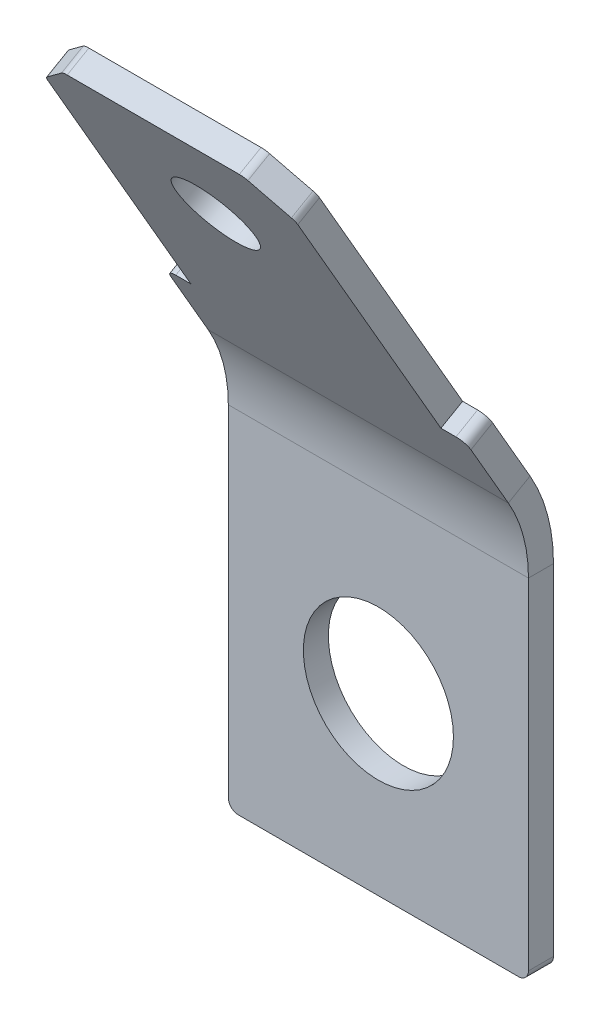
ISO-10303-21;
HEADER;
FILE_DESCRIPTION(('STEP AP214'),'2;1');
FILE_NAME('part.step','',(''),(''),'','','');
FILE_SCHEMA(('AUTOMOTIVE_DESIGN { 1 0 10303 214 1 1 1 1 }'));
ENDSEC;
DATA;
#1=APPLICATION_CONTEXT('core data for automotive mechanical design processes');
#2=APPLICATION_PROTOCOL_DEFINITION('international standard','automotive_design',2000,#1);
#3=PRODUCT_CONTEXT('',#1,'mechanical');
#4=PRODUCT('Part','Part','',(#3));
#5=PRODUCT_RELATED_PRODUCT_CATEGORY('part','',(#4));
#6=PRODUCT_DEFINITION_FORMATION('','',#4);
#7=PRODUCT_DEFINITION_CONTEXT('part definition',#1,'design');
#8=PRODUCT_DEFINITION('design','',#6,#7);
#9=PRODUCT_DEFINITION_SHAPE('','',#8);
#10=(LENGTH_UNIT() NAMED_UNIT(*) SI_UNIT(.MILLI.,.METRE.));
#11=(NAMED_UNIT(*) PLANE_ANGLE_UNIT() SI_UNIT($,.RADIAN.));
#12=(NAMED_UNIT(*) SI_UNIT($,.STERADIAN.) SOLID_ANGLE_UNIT());
#13=UNCERTAINTY_MEASURE_WITH_UNIT(LENGTH_MEASURE(1.E-05),#10,'distance_accuracy_value','');
#14=(GEOMETRIC_REPRESENTATION_CONTEXT(3) GLOBAL_UNCERTAINTY_ASSIGNED_CONTEXT((#13)) GLOBAL_UNIT_ASSIGNED_CONTEXT((#10,
#11,#12)) REPRESENTATION_CONTEXT('',''));
#15=CARTESIAN_POINT('',(0.,0.,0.));
#16=DIRECTION('',(0.,0.,1.));
#17=DIRECTION('',(1.,0.,0.));
#18=AXIS2_PLACEMENT_3D('',#15,#16,#17);
#19=CARTESIAN_POINT('',(0.,1.92884757729334,-1.94855715851498));
#20=DIRECTION('',(0.,-0.499999999999995,0.866025403784442));
#21=DIRECTION('',(0.,-0.866025403784442,-0.499999999999995));
#22=AXIS2_PLACEMENT_3D('',#19,#20,#21);
#23=PLANE('',#22);
#24=CARTESIAN_POINT('',(0.,10.1830127018922,2.81698729810775));
#25=DIRECTION('',(0.,-0.499999999999995,0.866025403784442));
#26=DIRECTION('',(0.,-0.866025403784442,-0.499999999999995));
#27=AXIS2_PLACEMENT_3D('',#24,#25,#26);
#28=CIRCLE('',#27,0.8);
#29=CARTESIAN_POINT('',(0.,9.49019237886468,2.41698729810775));
#30=VERTEX_POINT('',#29);
#31=EDGE_CURVE('E257',#30,#30,#28,.T.);
#32=ORIENTED_EDGE('',*,*,#31,.T.);
#33=EDGE_LOOP('',(#32));
#34=FACE_BOUND('',#33,.T.);
#35=DIRECTION('',(-1.,0.,0.));
#36=VECTOR('',#35,1.);
#37=CARTESIAN_POINT('',(2.49999999999999,6.71891108675446,0.816987298107766));
#38=LINE('',#37,#36);
#39=CARTESIAN_POINT('',(2.79999999999999,6.71891108675446,0.816987298107766));
#40=VERTEX_POINT('',#39);
#41=CARTESIAN_POINT('',(2.49999999999999,6.71891108675446,0.816987298107766));
#42=VERTEX_POINT('',#41);
#43=EDGE_CURVE('E230',#40,#42,#38,.T.);
#44=ORIENTED_EDGE('',*,*,#43,.F.);
#45=CARTESIAN_POINT('',(2.79999999999999,6.54570600599757,0.716987298107767));
#46=DIRECTION('',(0.,-0.499999999999995,0.866025403784442));
#47=DIRECTION('',(0.,-0.866025403784442,-0.499999999999995));
#48=AXIS2_PLACEMENT_3D('',#45,#46,#47);
#49=CIRCLE('',#48,0.2);
#50=CARTESIAN_POINT('',(2.99999999999999,6.54570600599757,0.716987298107767));
#51=VERTEX_POINT('',#50);
#52=EDGE_CURVE('E360',#40,#51,#49,.F.);
#53=ORIENTED_EDGE('',*,*,#52,.T.);
#54=DIRECTION('',(0.,-0.866025403784442,-0.499999999999995));
#55=VECTOR('',#54,1.);
#56=CARTESIAN_POINT('',(2.99999999999999,1.92884757729334,-1.94855715851498));
#57=LINE('',#56,#55);
#58=CARTESIAN_POINT('',(2.99999999999999,5.24999999999999,-0.0310889132455459));
#59=VERTEX_POINT('',#58);
#60=EDGE_CURVE('E269',#51,#59,#57,.T.);
#61=ORIENTED_EDGE('',*,*,#60,.T.);
#62=DIRECTION('',(-1.,0.,0.));
#63=VECTOR('',#62,1.);
#64=CARTESIAN_POINT('',(2.99999999999999,5.24999999999999,-0.0310889132455455));
#65=LINE('',#64,#63);
#66=CARTESIAN_POINT('',(-3.00000000000001,5.24999999999999,-0.0310889132455449));
#67=VERTEX_POINT('',#66);
#68=EDGE_CURVE('E286',#67,#59,#65,.F.);
#69=ORIENTED_EDGE('',*,*,#68,.F.);
#70=DIRECTION('',(0.,0.866025403784442,0.499999999999995));
#71=VECTOR('',#70,1.);
#72=CARTESIAN_POINT('',(-3.00000000000001,1.92884757729334,-1.94855715851498));
#73=LINE('',#72,#71);
#74=CARTESIAN_POINT('',(-3.00000000000001,6.54570600599757,0.716987298107767));
#75=VERTEX_POINT('',#74);
#76=EDGE_CURVE('E275',#67,#75,#73,.T.);
#77=ORIENTED_EDGE('',*,*,#76,.T.);
#78=CARTESIAN_POINT('',(-2.80000000000001,6.54570600599757,0.716987298107767));
#79=DIRECTION('',(0.,-0.499999999999995,0.866025403784442));
#80=DIRECTION('',(0.,-0.866025403784442,-0.499999999999995));
#81=AXIS2_PLACEMENT_3D('',#78,#79,#80);
#82=CIRCLE('',#81,0.2);
#83=CARTESIAN_POINT('',(-2.80000000000001,6.71891108675446,0.816987298107766));
#84=VERTEX_POINT('',#83);
#85=EDGE_CURVE('E358',#75,#84,#82,.F.);
#86=ORIENTED_EDGE('',*,*,#85,.T.);
#87=DIRECTION('',(-1.,0.,0.));
#88=VECTOR('',#87,1.);
#89=CARTESIAN_POINT('',(-2.50000000000001,6.71891108675446,0.816987298107766));
#90=LINE('',#89,#88);
#91=CARTESIAN_POINT('',(-2.50000000000001,6.71891108675446,0.816987298107767));
#92=VERTEX_POINT('',#91);
#93=EDGE_CURVE('E245',#92,#84,#90,.T.);
#94=ORIENTED_EDGE('',*,*,#93,.F.);
#95=DIRECTION('',(0.,-0.866025403784442,-0.499999999999995));
#96=VECTOR('',#95,1.);
#97=CARTESIAN_POINT('',(-2.50000000000001,11.7451905283833,3.71891108675442));
#98=LINE('',#97,#96);
#99=CARTESIAN_POINT('',(-2.50000000000001,11.6734466348619,3.67748973051712));
#100=VERTEX_POINT('',#99);
#101=EDGE_CURVE('E234',#100,#92,#98,.T.);
#102=ORIENTED_EDGE('',*,*,#101,.F.);
#103=CARTESIAN_POINT('',(-2.30000000000001,11.6734466348619,3.67748973051712));
#104=DIRECTION('',(0.,-0.499999999999995,0.866025403784442));
#105=DIRECTION('',(0.,-0.866025403784442,-0.499999999999995));
#106=AXIS2_PLACEMENT_3D('',#103,#104,#105);
#107=CIRCLE('',#106,0.2);
#108=CARTESIAN_POINT('',(-2.44142135623732,11.795921122001,3.74820040863577));
#109=VERTEX_POINT('',#108);
#110=EDGE_CURVE('E356',#100,#109,#107,.F.);
#111=ORIENTED_EDGE('',*,*,#110,.T.);
#112=DIRECTION('',(-0.707106781186552,-0.612372435695793,-0.353553390593268));
#113=VECTOR('',#112,1.);
#114=CARTESIAN_POINT('',(-1.80384757729338,12.3480762113533,4.06698729810773));
#115=LINE('',#114,#113);
#116=CARTESIAN_POINT('',(-1.86242622105607,12.2973456177356,4.03769797622639));
#117=VERTEX_POINT('',#116);
#118=EDGE_CURVE('E231',#117,#109,#115,.T.);
#119=ORIENTED_EDGE('',*,*,#118,.F.);
#120=CARTESIAN_POINT('',(-1.72100486481876,12.1748711305964,3.96698729810774));
#121=DIRECTION('',(0.,-0.499999999999995,0.866025403784442));
#122=DIRECTION('',(0.,-0.866025403784442,-0.499999999999995));
#123=AXIS2_PLACEMENT_3D('',#120,#121,#122);
#124=CIRCLE('',#123,0.2);
#125=CARTESIAN_POINT('',(-1.72100486481876,12.3480762113533,4.06698729810773));
#126=VERTEX_POINT('',#125);
#127=EDGE_CURVE('E354',#117,#126,#124,.F.);
#128=ORIENTED_EDGE('',*,*,#127,.T.);
#129=DIRECTION('',(1.,0.,0.));
#130=VECTOR('',#129,1.);
#131=CARTESIAN_POINT('',(0.,12.3480762113533,4.06698729810773));
#132=LINE('',#131,#130);
#133=CARTESIAN_POINT('',(1.72100486481874,12.3480762113533,4.06698729810773));
#134=VERTEX_POINT('',#133);
#135=EDGE_CURVE('E272',#126,#134,#132,.T.);
#136=ORIENTED_EDGE('',*,*,#135,.T.);
#137=CARTESIAN_POINT('',(1.72100486481874,12.1748711305964,3.96698729810774));
#138=DIRECTION('',(0.,-0.499999999999995,0.866025403784442));
#139=DIRECTION('',(0.,-0.866025403784442,-0.499999999999995));
#140=AXIS2_PLACEMENT_3D('',#137,#138,#139);
#141=CIRCLE('',#140,0.2);
#142=CARTESIAN_POINT('',(1.86242622105605,12.2973456177356,4.03769797622639));
#143=VERTEX_POINT('',#142);
#144=EDGE_CURVE('E352',#134,#143,#141,.F.);
#145=ORIENTED_EDGE('',*,*,#144,.T.);
#146=DIRECTION('',(-0.707106781186551,0.612372435695793,0.353553390593268));
#147=VECTOR('',#146,1.);
#148=CARTESIAN_POINT('',(1.80384757729335,12.3480762113533,4.06698729810773));
#149=LINE('',#148,#147);
#150=CARTESIAN_POINT('',(2.4414213562373,11.795921122001,3.74820040863577));
#151=VERTEX_POINT('',#150);
#152=EDGE_CURVE('E215',#151,#143,#149,.T.);
#153=ORIENTED_EDGE('',*,*,#152,.F.);
#154=CARTESIAN_POINT('',(2.29999999999999,11.6734466348619,3.67748973051711));
#155=DIRECTION('',(0.,-0.499999999999995,0.866025403784442));
#156=DIRECTION('',(0.,-0.866025403784442,-0.499999999999995));
#157=AXIS2_PLACEMENT_3D('',#154,#155,#156);
#158=CIRCLE('',#157,0.2);
#159=CARTESIAN_POINT('',(2.49999999999999,11.6734466348619,3.67748973051711));
#160=VERTEX_POINT('',#159);
#161=EDGE_CURVE('E350',#151,#160,#158,.F.);
#162=ORIENTED_EDGE('',*,*,#161,.T.);
#163=DIRECTION('',(0.,0.866025403784442,0.499999999999995));
#164=VECTOR('',#163,1.);
#165=CARTESIAN_POINT('',(2.49999999999999,11.7451905283833,3.71891108675442));
#166=LINE('',#165,#164);
#167=EDGE_CURVE('E483',#42,#160,#166,.T.);
#168=ORIENTED_EDGE('',*,*,#167,.F.);
#169=EDGE_LOOP('',(#44,#53,#61,#69,#77,#86,#94,#102,#111,#119,#128,#136,#145,#153,#162,#168));
#170=FACE_BOUND('',#169,.T.);
#171=ADVANCED_FACE('F57',(#34,#170),#23,.F.);
#172=CARTESIAN_POINT('',(0.,1.67884757729334,-1.51554445662276));
#173=DIRECTION('',(0.,-0.499999999999995,0.866025403784442));
#174=DIRECTION('',(0.,-0.866025403784442,-0.499999999999995));
#175=AXIS2_PLACEMENT_3D('',#172,#173,#174);
#176=PLANE('',#175);
#177=CARTESIAN_POINT('',(0.,9.93301270189223,3.24999999999997));
#178=DIRECTION('',(0.,-0.499999999999995,0.866025403784442));
#179=DIRECTION('',(0.,-0.866025403784442,-0.499999999999995));
#180=AXIS2_PLACEMENT_3D('',#177,#178,#179);
#181=CIRCLE('',#180,0.8);
#182=CARTESIAN_POINT('',(0.,9.24019237886468,2.84999999999997));
#183=VERTEX_POINT('',#182);
#184=EDGE_CURVE('E256',#183,#183,#181,.T.);
#185=ORIENTED_EDGE('',*,*,#184,.F.);
#186=EDGE_LOOP('',(#185));
#187=FACE_BOUND('',#186,.T.);
#188=DIRECTION('',(0.,0.866025403784442,0.499999999999995));
#189=VECTOR('',#188,1.);
#190=CARTESIAN_POINT('',(2.99999999999999,4.30384757729336,0.));
#191=LINE('',#190,#189);
#192=CARTESIAN_POINT('',(2.99999999999999,6.29570600599758,1.14999999999999));
#193=VERTEX_POINT('',#192);
#194=CARTESIAN_POINT('',(2.99999999999999,4.99999999999999,0.401923788646675));
#195=VERTEX_POINT('',#194);
#196=EDGE_CURVE('E278',#193,#195,#191,.F.);
#197=ORIENTED_EDGE('',*,*,#196,.F.);
#198=CARTESIAN_POINT('',(2.79999999999999,6.29570600599758,1.14999999999999));
#199=DIRECTION('',(0.,-0.499999999999995,0.866025403784442));
#200=DIRECTION('',(0.,-0.866025403784442,-0.499999999999995));
#201=AXIS2_PLACEMENT_3D('',#198,#199,#200);
#202=CIRCLE('',#201,0.2);
#203=CARTESIAN_POINT('',(2.79999999999999,6.46891108675446,1.24999999999999));
#204=VERTEX_POINT('',#203);
#205=EDGE_CURVE('E211',#193,#204,#202,.T.);
#206=ORIENTED_EDGE('',*,*,#205,.T.);
#207=DIRECTION('',(1.,0.,0.));
#208=VECTOR('',#207,1.);
#209=CARTESIAN_POINT('',(0.,6.46891108675446,1.24999999999999));
#210=LINE('',#209,#208);
#211=CARTESIAN_POINT('',(2.49999999999999,6.46891108675446,1.24999999999999));
#212=VERTEX_POINT('',#211);
#213=EDGE_CURVE('E206',#204,#212,#210,.F.);
#214=ORIENTED_EDGE('',*,*,#213,.T.);
#215=DIRECTION('',(0.,-0.866025403784442,-0.499999999999995));
#216=VECTOR('',#215,1.);
#217=CARTESIAN_POINT('',(2.49999999999999,1.67884757729334,-1.51554445662276));
#218=LINE('',#217,#216);
#219=CARTESIAN_POINT('',(2.49999999999999,11.4234466348619,4.11050243240934));
#220=VERTEX_POINT('',#219);
#221=EDGE_CURVE('E210',#212,#220,#218,.F.);
#222=ORIENTED_EDGE('',*,*,#221,.T.);
#223=CARTESIAN_POINT('',(2.29999999999999,11.4234466348619,4.11050243240933));
#224=DIRECTION('',(0.,-0.499999999999995,0.866025403784442));
#225=DIRECTION('',(0.,-0.866025403784442,-0.499999999999995));
#226=AXIS2_PLACEMENT_3D('',#223,#224,#225);
#227=CIRCLE('',#226,0.2);
#228=CARTESIAN_POINT('',(2.4414213562373,11.545921122001,4.18121311052799));
#229=VERTEX_POINT('',#228);
#230=EDGE_CURVE('E337',#220,#229,#227,.T.);
#231=ORIENTED_EDGE('',*,*,#230,.T.);
#232=DIRECTION('',(-0.707106781186551,0.612372435695793,0.353553390593268));
#233=VECTOR('',#232,1.);
#234=CARTESIAN_POINT('',(1.80384757729335,12.0980762113533,4.49999999999995));
#235=LINE('',#234,#233);
#236=CARTESIAN_POINT('',(1.86242622105605,12.0473456177356,4.47071067811861));
#237=VERTEX_POINT('',#236);
#238=EDGE_CURVE('E226',#229,#237,#235,.T.);
#239=ORIENTED_EDGE('',*,*,#238,.T.);
#240=CARTESIAN_POINT('',(1.72100486481874,11.9248711305964,4.39999999999996));
#241=DIRECTION('',(0.,-0.499999999999995,0.866025403784442));
#242=DIRECTION('',(0.,-0.866025403784442,-0.499999999999995));
#243=AXIS2_PLACEMENT_3D('',#240,#241,#242);
#244=CIRCLE('',#243,0.2);
#245=CARTESIAN_POINT('',(1.72100486481874,12.0980762113533,4.49999999999995));
#246=VERTEX_POINT('',#245);
#247=EDGE_CURVE('E339',#237,#246,#244,.T.);
#248=ORIENTED_EDGE('',*,*,#247,.T.);
#249=DIRECTION('',(-1.,0.,0.));
#250=VECTOR('',#249,1.);
#251=CARTESIAN_POINT('',(2.99999999999999,12.0980762113533,4.49999999999995));
#252=LINE('',#251,#250);
#253=CARTESIAN_POINT('',(-1.72100486481876,12.0980762113533,4.49999999999995));
#254=VERTEX_POINT('',#253);
#255=EDGE_CURVE('E280',#254,#246,#252,.F.);
#256=ORIENTED_EDGE('',*,*,#255,.F.);
#257=CARTESIAN_POINT('',(-1.72100486481876,11.9248711305964,4.39999999999996));
#258=DIRECTION('',(0.,-0.499999999999995,0.866025403784442));
#259=DIRECTION('',(0.,-0.866025403784442,-0.499999999999995));
#260=AXIS2_PLACEMENT_3D('',#257,#258,#259);
#261=CIRCLE('',#260,0.2);
#262=CARTESIAN_POINT('',(-1.86242622105607,12.0473456177356,4.47071067811861));
#263=VERTEX_POINT('',#262);
#264=EDGE_CURVE('E341',#254,#263,#261,.T.);
#265=ORIENTED_EDGE('',*,*,#264,.T.);
#266=DIRECTION('',(-0.707106781186552,-0.612372435695793,-0.353553390593268));
#267=VECTOR('',#266,1.);
#268=CARTESIAN_POINT('',(-1.80384757729338,12.0980762113533,4.49999999999995));
#269=LINE('',#268,#267);
#270=CARTESIAN_POINT('',(-2.44142135623732,11.545921122001,4.18121311052799));
#271=VERTEX_POINT('',#270);
#272=EDGE_CURVE('E241',#263,#271,#269,.T.);
#273=ORIENTED_EDGE('',*,*,#272,.T.);
#274=CARTESIAN_POINT('',(-2.30000000000001,11.4234466348619,4.11050243240934));
#275=DIRECTION('',(0.,-0.499999999999995,0.866025403784442));
#276=DIRECTION('',(0.,-0.866025403784442,-0.499999999999995));
#277=AXIS2_PLACEMENT_3D('',#274,#275,#276);
#278=CIRCLE('',#277,0.2);
#279=CARTESIAN_POINT('',(-2.50000000000001,11.4234466348619,4.11050243240934));
#280=VERTEX_POINT('',#279);
#281=EDGE_CURVE('E343',#271,#280,#278,.T.);
#282=ORIENTED_EDGE('',*,*,#281,.T.);
#283=DIRECTION('',(0.,-0.866025403784442,-0.499999999999995));
#284=VECTOR('',#283,1.);
#285=CARTESIAN_POINT('',(-2.50000000000001,1.67884757729334,-1.51554445662276));
#286=LINE('',#285,#284);
#287=CARTESIAN_POINT('',(-2.50000000000001,6.46891108675446,1.24999999999999));
#288=VERTEX_POINT('',#287);
#289=EDGE_CURVE('E244',#280,#288,#286,.T.);
#290=ORIENTED_EDGE('',*,*,#289,.T.);
#291=DIRECTION('',(1.,0.,0.));
#292=VECTOR('',#291,1.);
#293=CARTESIAN_POINT('',(0.,6.46891108675446,1.24999999999999));
#294=LINE('',#293,#292);
#295=CARTESIAN_POINT('',(-2.80000000000001,6.46891108675446,1.24999999999999));
#296=VERTEX_POINT('',#295);
#297=EDGE_CURVE('E246',#288,#296,#294,.F.);
#298=ORIENTED_EDGE('',*,*,#297,.T.);
#299=CARTESIAN_POINT('',(-2.80000000000001,6.29570600599758,1.14999999999999));
#300=DIRECTION('',(0.,-0.499999999999995,0.866025403784442));
#301=DIRECTION('',(0.,-0.866025403784442,-0.499999999999995));
#302=AXIS2_PLACEMENT_3D('',#299,#300,#301);
#303=CIRCLE('',#302,0.2);
#304=CARTESIAN_POINT('',(-3.00000000000001,6.29570600599758,1.14999999999999));
#305=VERTEX_POINT('',#304);
#306=EDGE_CURVE('E345',#296,#305,#303,.T.);
#307=ORIENTED_EDGE('',*,*,#306,.T.);
#308=DIRECTION('',(0.,-0.866025403784442,-0.499999999999995));
#309=VECTOR('',#308,1.);
#310=CARTESIAN_POINT('',(-3.00000000000001,12.0980762113533,4.49999999999995));
#311=LINE('',#310,#309);
#312=CARTESIAN_POINT('',(-3.00000000000001,4.99999999999999,0.401923788646675));
#313=VERTEX_POINT('',#312);
#314=EDGE_CURVE('E283',#313,#305,#311,.F.);
#315=ORIENTED_EDGE('',*,*,#314,.F.);
#316=DIRECTION('',(-1.,0.,0.));
#317=VECTOR('',#316,1.);
#318=CARTESIAN_POINT('',(2.99999999999999,4.99999999999999,0.401923788646675));
#319=LINE('',#318,#317);
#320=EDGE_CURVE('E292',#195,#313,#319,.T.);
#321=ORIENTED_EDGE('',*,*,#320,.F.);
#322=EDGE_LOOP('',(#197,#206,#214,#222,#231,#239,#248,#256,#265,#273,#282,#290,#298,#307,#315,#321));
#323=FACE_BOUND('',#322,.T.);
#324=ADVANCED_FACE('F209',(#187,#323),#176,.T.);
#325=CARTESIAN_POINT('',(2.99999999999999,12.3480762113533,4.06698729810773));
#326=DIRECTION('',(0.,-0.866025403784442,-0.499999999999995));
#327=DIRECTION('',(0.,0.499999999999995,-0.866025403784442));
#328=AXIS2_PLACEMENT_3D('',#325,#326,#327);
#329=PLANE('',#328);
#330=ORIENTED_EDGE('',*,*,#135,.F.);
#331=DIRECTION('',(0.,-0.499999999999995,0.866025403784442));
#332=VECTOR('',#331,1.);
#333=CARTESIAN_POINT('',(-1.72100486481876,12.0980762113533,4.49999999999995));
#334=LINE('',#333,#332);
#335=EDGE_CURVE('E376',#126,#254,#334,.T.);
#336=ORIENTED_EDGE('',*,*,#335,.T.);
#337=ORIENTED_EDGE('',*,*,#255,.T.);
#338=DIRECTION('',(0.,-0.499999999999995,0.866025403784442));
#339=VECTOR('',#338,1.);
#340=CARTESIAN_POINT('',(1.72100486481874,12.3480762113533,4.06698729810773));
#341=LINE('',#340,#339);
#342=EDGE_CURVE('E374',#246,#134,#341,.F.);
#343=ORIENTED_EDGE('',*,*,#342,.T.);
#344=EDGE_LOOP('',(#330,#336,#337,#343));
#345=FACE_BOUND('',#344,.T.);
#346=ADVANCED_FACE('F470',(#345),#329,.F.);
#347=CARTESIAN_POINT('',(2.99999999999999,4.55384757729336,-0.433012701892221));
#348=DIRECTION('',(-1.,0.,0.));
#349=DIRECTION('',(0.,0.,1.));
#350=AXIS2_PLACEMENT_3D('',#347,#348,#349);
#351=PLANE('',#350);
#352=ORIENTED_EDGE('',*,*,#60,.F.);
#353=DIRECTION('',(0.,-0.499999999999995,0.866025403784442));
#354=VECTOR('',#353,1.);
#355=CARTESIAN_POINT('',(2.99999999999999,6.29570600599758,1.14999999999999));
#356=LINE('',#355,#354);
#357=EDGE_CURVE('E332',#51,#193,#356,.T.);
#358=ORIENTED_EDGE('',*,*,#357,.T.);
#359=ORIENTED_EDGE('',*,*,#196,.T.);
#360=DIRECTION('',(0.,-0.499999999999995,0.866025403784442));
#361=VECTOR('',#360,1.);
#362=CARTESIAN_POINT('',(2.99999999999999,5.24999999999999,-0.0310889132455457));
#363=LINE('',#362,#361);
#364=EDGE_CURVE('E266',#195,#59,#363,.F.);
#365=ORIENTED_EDGE('',*,*,#364,.T.);
#366=EDGE_LOOP('',(#352,#358,#359,#365));
#367=FACE_BOUND('',#366,.T.);
#368=ADVANCED_FACE('F428',(#367),#351,.F.);
#369=CARTESIAN_POINT('',(-3.00000000000001,12.3480762113533,4.06698729810773));
#370=DIRECTION('',(1.,0.,0.));
#371=DIRECTION('',(0.,0.,-1.));
#372=AXIS2_PLACEMENT_3D('',#369,#370,#371);
#373=PLANE('',#372);
#374=ORIENTED_EDGE('',*,*,#314,.T.);
#375=DIRECTION('',(0.,-0.499999999999995,0.866025403784442));
#376=VECTOR('',#375,1.);
#377=CARTESIAN_POINT('',(-3.00000000000001,6.54570600599757,0.716987298107767));
#378=LINE('',#377,#376);
#379=EDGE_CURVE('E365',#305,#75,#378,.F.);
#380=ORIENTED_EDGE('',*,*,#379,.T.);
#381=ORIENTED_EDGE('',*,*,#76,.F.);
#382=DIRECTION('',(0.,-0.499999999999995,0.866025403784442));
#383=VECTOR('',#382,1.);
#384=CARTESIAN_POINT('',(-3.00000000000001,4.99999999999999,0.401923788646676));
#385=LINE('',#384,#383);
#386=EDGE_CURVE('E289',#313,#67,#385,.F.);
#387=ORIENTED_EDGE('',*,*,#386,.F.);
#388=EDGE_LOOP('',(#374,#380,#381,#387));
#389=FACE_BOUND('',#388,.T.);
#390=ADVANCED_FACE('F437',(#389),#373,.F.);
#391=CARTESIAN_POINT('',(2.99999999999999,-3.5,-0.5));
#392=DIRECTION('',(1.,0.,0.));
#393=DIRECTION('',(0.,0.,-1.));
#394=AXIS2_PLACEMENT_3D('',#391,#392,#393);
#395=PLANE('',#394);
#396=DIRECTION('',(0.,1.,0.));
#397=VECTOR('',#396,1.);
#398=CARTESIAN_POINT('',(2.99999999999999,-3.5,0.));
#399=LINE('',#398,#397);
#400=CARTESIAN_POINT('',(2.99999999999999,-3.3,0.));
#401=VERTEX_POINT('',#400);
#402=CARTESIAN_POINT('',(2.99999999999999,3.5,0.));
#403=VERTEX_POINT('',#402);
#404=EDGE_CURVE('E299',#401,#403,#399,.T.);
#405=ORIENTED_EDGE('',*,*,#404,.F.);
#406=DIRECTION('',(0.,0.,1.));
#407=VECTOR('',#406,1.);
#408=CARTESIAN_POINT('',(2.99999999999999,-3.3,-0.5));
#409=LINE('',#408,#407);
#410=CARTESIAN_POINT('',(2.99999999999999,-3.3,-0.5));
#411=VERTEX_POINT('',#410);
#412=EDGE_CURVE('E13',#401,#411,#409,.F.);
#413=ORIENTED_EDGE('',*,*,#412,.T.);
#414=DIRECTION('',(0.,1.,0.));
#415=VECTOR('',#414,1.);
#416=CARTESIAN_POINT('',(2.99999999999999,-3.5,-0.5));
#417=LINE('',#416,#415);
#418=CARTESIAN_POINT('',(2.99999999999999,3.5,-0.5));
#419=VERTEX_POINT('',#418);
#420=EDGE_CURVE('E308',#411,#419,#417,.T.);
#421=ORIENTED_EDGE('',*,*,#420,.T.);
#422=DIRECTION('',(0.,0.,1.));
#423=VECTOR('',#422,1.);
#424=CARTESIAN_POINT('',(2.99999999999999,3.5,-0.5));
#425=LINE('',#424,#423);
#426=EDGE_CURVE('E319',#419,#403,#425,.T.);
#427=ORIENTED_EDGE('',*,*,#426,.T.);
#428=EDGE_LOOP('',(#405,#413,#421,#427));
#429=FACE_BOUND('',#428,.T.);
#430=ADVANCED_FACE('F414',(#429),#395,.T.);
#431=CARTESIAN_POINT('',(-3.00000000000001,-3.5,-0.5));
#432=DIRECTION('',(0.,-1.,0.));
#433=DIRECTION('',(0.,0.,-1.));
#434=AXIS2_PLACEMENT_3D('',#431,#432,#433);
#435=PLANE('',#434);
#436=DIRECTION('',(1.,0.,0.));
#437=VECTOR('',#436,1.);
#438=CARTESIAN_POINT('',(-3.00000000000001,-3.5,0.));
#439=LINE('',#438,#437);
#440=CARTESIAN_POINT('',(-2.80000000000001,-3.5,0.));
#441=VERTEX_POINT('',#440);
#442=CARTESIAN_POINT('',(2.79999999999999,-3.5,0.));
#443=VERTEX_POINT('',#442);
#444=EDGE_CURVE('E311',#441,#443,#439,.T.);
#445=ORIENTED_EDGE('',*,*,#444,.F.);
#446=DIRECTION('',(0.,0.,1.));
#447=VECTOR('',#446,1.);
#448=CARTESIAN_POINT('',(-2.80000000000001,-3.5,-0.5));
#449=LINE('',#448,#447);
#450=CARTESIAN_POINT('',(-2.80000000000001,-3.5,-0.5));
#451=VERTEX_POINT('',#450);
#452=EDGE_CURVE('E395',#441,#451,#449,.F.);
#453=ORIENTED_EDGE('',*,*,#452,.T.);
#454=DIRECTION('',(1.,0.,0.));
#455=VECTOR('',#454,1.);
#456=CARTESIAN_POINT('',(-3.00000000000001,-3.5,-0.5));
#457=LINE('',#456,#455);
#458=CARTESIAN_POINT('',(2.79999999999999,-3.5,-0.5));
#459=VERTEX_POINT('',#458);
#460=EDGE_CURVE('E317',#451,#459,#457,.T.);
#461=ORIENTED_EDGE('',*,*,#460,.T.);
#462=DIRECTION('',(0.,0.,1.));
#463=VECTOR('',#462,1.);
#464=CARTESIAN_POINT('',(2.79999999999999,-3.5,-0.5));
#465=LINE('',#464,#463);
#466=EDGE_CURVE('E392',#459,#443,#465,.T.);
#467=ORIENTED_EDGE('',*,*,#466,.T.);
#468=EDGE_LOOP('',(#445,#453,#461,#467));
#469=FACE_BOUND('',#468,.T.);
#470=ADVANCED_FACE('F411',(#469),#435,.T.);
#471=CARTESIAN_POINT('',(-3.00000000000001,-3.5,-0.5));
#472=DIRECTION('',(-1.,0.,0.));
#473=DIRECTION('',(0.,0.,1.));
#474=AXIS2_PLACEMENT_3D('',#471,#472,#473);
#475=PLANE('',#474);
#476=DIRECTION('',(0.,-1.,0.));
#477=VECTOR('',#476,1.);
#478=CARTESIAN_POINT('',(-3.00000000000001,-3.5,-0.5));
#479=LINE('',#478,#477);
#480=CARTESIAN_POINT('',(-3.00000000000001,3.5,-0.5));
#481=VERTEX_POINT('',#480);
#482=CARTESIAN_POINT('',(-3.00000000000001,-3.3,-0.5));
#483=VERTEX_POINT('',#482);
#484=EDGE_CURVE('E314',#481,#483,#479,.T.);
#485=ORIENTED_EDGE('',*,*,#484,.T.);
#486=DIRECTION('',(0.,0.,1.));
#487=VECTOR('',#486,1.);
#488=CARTESIAN_POINT('',(-3.00000000000001,-3.3,-0.5));
#489=LINE('',#488,#487);
#490=CARTESIAN_POINT('',(-3.00000000000001,-3.3,0.));
#491=VERTEX_POINT('',#490);
#492=EDGE_CURVE('E385',#483,#491,#489,.T.);
#493=ORIENTED_EDGE('',*,*,#492,.T.);
#494=DIRECTION('',(0.,-1.,0.));
#495=VECTOR('',#494,1.);
#496=CARTESIAN_POINT('',(-3.00000000000001,-3.5,0.));
#497=LINE('',#496,#495);
#498=CARTESIAN_POINT('',(-3.00000000000001,3.5,0.));
#499=VERTEX_POINT('',#498);
#500=EDGE_CURVE('E324',#499,#491,#497,.T.);
#501=ORIENTED_EDGE('',*,*,#500,.F.);
#502=DIRECTION('',(0.,0.,1.));
#503=VECTOR('',#502,1.);
#504=CARTESIAN_POINT('',(-3.00000000000001,3.5,-0.5));
#505=LINE('',#504,#503);
#506=EDGE_CURVE('E329',#481,#499,#505,.T.);
#507=ORIENTED_EDGE('',*,*,#506,.F.);
#508=EDGE_LOOP('',(#485,#493,#501,#507));
#509=FACE_BOUND('',#508,.T.);
#510=ADVANCED_FACE('F405',(#509),#475,.T.);
#511=CARTESIAN_POINT('',(0.,0.,-0.5));
#512=DIRECTION('',(0.,0.,-1.));
#513=DIRECTION('',(-1.,0.,0.));
#514=AXIS2_PLACEMENT_3D('',#511,#512,#513);
#515=PLANE('',#514);
#516=CARTESIAN_POINT('',(0.,0.,-0.5));
#517=DIRECTION('',(0.,0.,1.));
#518=DIRECTION('',(1.,0.,0.));
#519=AXIS2_PLACEMENT_3D('',#516,#517,#518);
#520=CIRCLE('',#519,1.5);
#521=CARTESIAN_POINT('',(1.49999999999999,0.,-0.5));
#522=VERTEX_POINT('',#521);
#523=EDGE_CURVE('E263',#522,#522,#520,.T.);
#524=ORIENTED_EDGE('',*,*,#523,.T.);
#525=EDGE_LOOP('',(#524));
#526=FACE_BOUND('',#525,.T.);
#527=ORIENTED_EDGE('',*,*,#460,.F.);
#528=CARTESIAN_POINT('',(-2.80000000000001,-3.3,-0.5));
#529=DIRECTION('',(0.,0.,-1.));
#530=DIRECTION('',(-1.,0.,0.));
#531=AXIS2_PLACEMENT_3D('',#528,#529,#530);
#532=CIRCLE('',#531,0.2);
#533=EDGE_CURVE('E65',#451,#483,#532,.T.);
#534=ORIENTED_EDGE('',*,*,#533,.T.);
#535=ORIENTED_EDGE('',*,*,#484,.F.);
#536=DIRECTION('',(-1.,0.,0.));
#537=VECTOR('',#536,1.);
#538=CARTESIAN_POINT('',(-3.00000000000001,3.5,-0.5));
#539=LINE('',#538,#537);
#540=EDGE_CURVE('E310',#419,#481,#539,.T.);
#541=ORIENTED_EDGE('',*,*,#540,.F.);
#542=ORIENTED_EDGE('',*,*,#420,.F.);
#543=CARTESIAN_POINT('',(2.79999999999999,-3.3,-0.5));
#544=DIRECTION('',(0.,0.,-1.));
#545=DIRECTION('',(-1.,0.,0.));
#546=AXIS2_PLACEMENT_3D('',#543,#544,#545);
#547=CIRCLE('',#546,0.2);
#548=EDGE_CURVE('E77',#411,#459,#547,.T.);
#549=ORIENTED_EDGE('',*,*,#548,.T.);
#550=EDGE_LOOP('',(#527,#534,#535,#541,#542,#549));
#551=FACE_BOUND('',#550,.T.);
#552=ADVANCED_FACE('F398',(#526,#551),#515,.T.);
#553=CARTESIAN_POINT('',(0.,0.,0.));
#554=DIRECTION('',(0.,0.,-1.));
#555=DIRECTION('',(-1.,0.,0.));
#556=AXIS2_PLACEMENT_3D('',#553,#554,#555);
#557=PLANE('',#556);
#558=CARTESIAN_POINT('',(0.,0.,0.));
#559=DIRECTION('',(0.,0.,1.));
#560=DIRECTION('',(1.,0.,0.));
#561=AXIS2_PLACEMENT_3D('',#558,#559,#560);
#562=CIRCLE('',#561,1.5);
#563=CARTESIAN_POINT('',(1.49999999999999,0.,0.));
#564=VERTEX_POINT('',#563);
#565=EDGE_CURVE('E260',#564,#564,#562,.T.);
#566=ORIENTED_EDGE('',*,*,#565,.F.);
#567=EDGE_LOOP('',(#566));
#568=FACE_BOUND('',#567,.T.);
#569=ORIENTED_EDGE('',*,*,#500,.T.);
#570=CARTESIAN_POINT('',(-2.80000000000001,-3.3,0.));
#571=DIRECTION('',(0.,0.,-1.));
#572=DIRECTION('',(-1.,0.,0.));
#573=AXIS2_PLACEMENT_3D('',#570,#571,#572);
#574=CIRCLE('',#573,0.2);
#575=EDGE_CURVE('E390',#491,#441,#574,.F.);
#576=ORIENTED_EDGE('',*,*,#575,.T.);
#577=ORIENTED_EDGE('',*,*,#444,.T.);
#578=CARTESIAN_POINT('',(2.79999999999999,-3.3,0.));
#579=DIRECTION('',(0.,0.,-1.));
#580=DIRECTION('',(-1.,0.,0.));
#581=AXIS2_PLACEMENT_3D('',#578,#579,#580);
#582=CIRCLE('',#581,0.2);
#583=EDGE_CURVE('E388',#443,#401,#582,.F.);
#584=ORIENTED_EDGE('',*,*,#583,.T.);
#585=ORIENTED_EDGE('',*,*,#404,.T.);
#586=DIRECTION('',(-1.,0.,0.));
#587=VECTOR('',#586,1.);
#588=CARTESIAN_POINT('',(-3.00000000000001,3.5,0.));
#589=LINE('',#588,#587);
#590=EDGE_CURVE('E321',#403,#499,#589,.T.);
#591=ORIENTED_EDGE('',*,*,#590,.T.);
#592=EDGE_LOOP('',(#569,#576,#577,#584,#585,#591));
#593=FACE_BOUND('',#592,.T.);
#594=ADVANCED_FACE('F409',(#568,#593),#557,.F.);
#595=CARTESIAN_POINT('',(2.99999999999999,3.5,3.));
#596=DIRECTION('',(1.,0.,0.));
#597=DIRECTION('',(0.,0.,-1.));
#598=AXIS2_PLACEMENT_3D('',#595,#596,#597);
#599=PLANE('',#598);
#600=ORIENTED_EDGE('',*,*,#364,.F.);
#601=CARTESIAN_POINT('',(2.99999999999999,3.5,3.));
#602=DIRECTION('',(-1.,0.,0.));
#603=DIRECTION('',(0.,0.,1.));
#604=AXIS2_PLACEMENT_3D('',#601,#602,#603);
#605=CIRCLE('',#604,3.);
#606=EDGE_CURVE('E303',#403,#195,#605,.F.);
#607=ORIENTED_EDGE('',*,*,#606,.F.);
#608=ORIENTED_EDGE('',*,*,#426,.F.);
#609=CARTESIAN_POINT('',(2.99999999999999,3.5,3.));
#610=DIRECTION('',(-1.,0.,0.));
#611=DIRECTION('',(0.,0.,1.));
#612=AXIS2_PLACEMENT_3D('',#609,#610,#611);
#613=CIRCLE('',#612,3.5);
#614=EDGE_CURVE('E296',#419,#59,#613,.F.);
#615=ORIENTED_EDGE('',*,*,#614,.T.);
#616=EDGE_LOOP('',(#600,#607,#608,#615));
#617=FACE_BOUND('',#616,.T.);
#618=ADVANCED_FACE('F425',(#617),#599,.T.);
#619=CARTESIAN_POINT('',(-3.00000000000001,3.5,3.));
#620=DIRECTION('',(1.,0.,0.));
#621=DIRECTION('',(0.,0.,-1.));
#622=AXIS2_PLACEMENT_3D('',#619,#620,#621);
#623=PLANE('',#622);
#624=CARTESIAN_POINT('',(-3.00000000000001,3.5,3.));
#625=DIRECTION('',(-1.,0.,0.));
#626=DIRECTION('',(0.,0.,1.));
#627=AXIS2_PLACEMENT_3D('',#624,#625,#626);
#628=CIRCLE('',#627,3.);
#629=EDGE_CURVE('E271',#313,#499,#628,.T.);
#630=ORIENTED_EDGE('',*,*,#629,.F.);
#631=ORIENTED_EDGE('',*,*,#386,.T.);
#632=CARTESIAN_POINT('',(-3.00000000000001,3.5,3.));
#633=DIRECTION('',(-1.,0.,0.));
#634=DIRECTION('',(0.,0.,1.));
#635=AXIS2_PLACEMENT_3D('',#632,#633,#634);
#636=CIRCLE('',#635,3.5);
#637=EDGE_CURVE('E300',#67,#481,#636,.T.);
#638=ORIENTED_EDGE('',*,*,#637,.T.);
#639=ORIENTED_EDGE('',*,*,#506,.T.);
#640=EDGE_LOOP('',(#630,#631,#638,#639));
#641=FACE_BOUND('',#640,.T.);
#642=ADVANCED_FACE('F433',(#641),#623,.F.);
#643=CARTESIAN_POINT('',(-3.00000000000001,3.5,3.));
#644=DIRECTION('',(-1.,0.,0.));
#645=DIRECTION('',(0.,0.499999999999995,-0.866025403784442));
#646=AXIS2_PLACEMENT_3D('',#643,#644,#645);
#647=CYLINDRICAL_SURFACE('',#646,3.5);
#648=ORIENTED_EDGE('',*,*,#540,.T.);
#649=ORIENTED_EDGE('',*,*,#637,.F.);
#650=ORIENTED_EDGE('',*,*,#68,.T.);
#651=ORIENTED_EDGE('',*,*,#614,.F.);
#652=EDGE_LOOP('',(#648,#649,#650,#651));
#653=FACE_BOUND('',#652,.T.);
#654=ADVANCED_FACE('F512',(#653),#647,.T.);
#655=CARTESIAN_POINT('',(-3.00000000000001,3.5,3.));
#656=DIRECTION('',(-1.,0.,0.));
#657=DIRECTION('',(0.,0.499999999999995,-0.866025403784442));
#658=AXIS2_PLACEMENT_3D('',#655,#656,#657);
#659=CYLINDRICAL_SURFACE('',#658,3.);
#660=ORIENTED_EDGE('',*,*,#590,.F.);
#661=ORIENTED_EDGE('',*,*,#606,.T.);
#662=ORIENTED_EDGE('',*,*,#320,.T.);
#663=ORIENTED_EDGE('',*,*,#629,.T.);
#664=EDGE_LOOP('',(#660,#661,#662,#663));
#665=FACE_BOUND('',#664,.T.);
#666=ADVANCED_FACE('F421',(#665),#659,.F.);
#667=CARTESIAN_POINT('',(0.,0.,-0.5));
#668=DIRECTION('',(0.,0.,1.));
#669=DIRECTION('',(1.,0.,0.));
#670=AXIS2_PLACEMENT_3D('',#667,#668,#669);
#671=CYLINDRICAL_SURFACE('',#670,1.5);
#672=ORIENTED_EDGE('',*,*,#523,.F.);
#673=EDGE_LOOP('',(#672));
#674=FACE_BOUND('',#673,.T.);
#675=ORIENTED_EDGE('',*,*,#565,.T.);
#676=EDGE_LOOP('',(#675));
#677=FACE_BOUND('',#676,.T.);
#678=ADVANCED_FACE('F503',(#674,#677),#671,.F.);
#679=CARTESIAN_POINT('',(0.,9.93301270189223,3.24999999999997));
#680=DIRECTION('',(0.,-0.499999999999995,0.866025403784442));
#681=DIRECTION('',(0.,-0.866025403784442,-0.499999999999995));
#682=AXIS2_PLACEMENT_3D('',#679,#680,#681);
#683=CYLINDRICAL_SURFACE('',#682,0.8);
#684=ORIENTED_EDGE('',*,*,#31,.F.);
#685=EDGE_LOOP('',(#684));
#686=FACE_BOUND('',#685,.T.);
#687=ORIENTED_EDGE('',*,*,#184,.T.);
#688=EDGE_LOOP('',(#687));
#689=FACE_BOUND('',#688,.T.);
#690=ADVANCED_FACE('F646',(#686,#689),#683,.F.);
#691=CARTESIAN_POINT('',(-2.50000000000001,6.71891108675446,0.816987298107766));
#692=DIRECTION('',(0.,0.866025403784442,0.499999999999995));
#693=DIRECTION('',(-1.,0.,0.));
#694=AXIS2_PLACEMENT_3D('',#691,#692,#693);
#695=PLANE('',#694);
#696=ORIENTED_EDGE('',*,*,#93,.T.);
#697=DIRECTION('',(0.,-0.499999999999995,0.866025403784442));
#698=VECTOR('',#697,1.);
#699=CARTESIAN_POINT('',(-2.80000000000001,6.46891108675446,1.24999999999999));
#700=LINE('',#699,#698);
#701=EDGE_CURVE('E362',#84,#296,#700,.T.);
#702=ORIENTED_EDGE('',*,*,#701,.T.);
#703=ORIENTED_EDGE('',*,*,#297,.F.);
#704=DIRECTION('',(0.,0.499999999999995,-0.866025403784442));
#705=VECTOR('',#704,1.);
#706=CARTESIAN_POINT('',(-2.50000000000001,6.71891108675446,0.816987298107767));
#707=LINE('',#706,#705);
#708=EDGE_CURVE('E249',#92,#288,#707,.F.);
#709=ORIENTED_EDGE('',*,*,#708,.F.);
#710=EDGE_LOOP('',(#696,#702,#703,#709));
#711=FACE_BOUND('',#710,.T.);
#712=ADVANCED_FACE('F447',(#711),#695,.T.);
#713=CARTESIAN_POINT('',(-1.80384757729338,12.3480762113533,4.06698729810773));
#714=DIRECTION('',(-0.707106781186543,0.612372435695801,0.353553390593273));
#715=DIRECTION('',(-0.707106781186552,-0.612372435695793,-0.353553390593268));
#716=AXIS2_PLACEMENT_3D('',#713,#714,#715);
#717=PLANE('',#716);
#718=ORIENTED_EDGE('',*,*,#118,.T.);
#719=DIRECTION('',(0.,-0.499999999999995,0.866025403784442));
#720=VECTOR('',#719,1.);
#721=CARTESIAN_POINT('',(-2.44142135623732,11.795921122001,3.74820040863577));
#722=LINE('',#721,#720);
#723=EDGE_CURVE('E369',#109,#271,#722,.T.);
#724=ORIENTED_EDGE('',*,*,#723,.T.);
#725=ORIENTED_EDGE('',*,*,#272,.F.);
#726=DIRECTION('',(0.,-0.499999999999995,0.866025403784442));
#727=VECTOR('',#726,1.);
#728=CARTESIAN_POINT('',(-1.86242622105607,12.2973456177356,4.03769797622639));
#729=LINE('',#728,#727);
#730=EDGE_CURVE('E367',#263,#117,#729,.F.);
#731=ORIENTED_EDGE('',*,*,#730,.T.);
#732=EDGE_LOOP('',(#718,#724,#725,#731));
#733=FACE_BOUND('',#732,.T.);
#734=ADVANCED_FACE('F461',(#733),#717,.T.);
#735=CARTESIAN_POINT('',(-2.50000000000001,11.7451905283833,3.71891108675442));
#736=DIRECTION('',(-1.,0.,0.));
#737=DIRECTION('',(0.,-0.866025403784442,-0.499999999999995));
#738=AXIS2_PLACEMENT_3D('',#735,#736,#737);
#739=PLANE('',#738);
#740=ORIENTED_EDGE('',*,*,#289,.F.);
#741=DIRECTION('',(0.,-0.499999999999995,0.866025403784442));
#742=VECTOR('',#741,1.);
#743=CARTESIAN_POINT('',(-2.50000000000001,11.6734466348619,3.67748973051712));
#744=LINE('',#743,#742);
#745=EDGE_CURVE('E372',#280,#100,#744,.F.);
#746=ORIENTED_EDGE('',*,*,#745,.T.);
#747=ORIENTED_EDGE('',*,*,#101,.T.);
#748=ORIENTED_EDGE('',*,*,#708,.T.);
#749=EDGE_LOOP('',(#740,#746,#747,#748));
#750=FACE_BOUND('',#749,.T.);
#751=ADVANCED_FACE('F452',(#750),#739,.T.);
#752=CARTESIAN_POINT('',(1.80384757729335,12.3480762113533,4.06698729810773));
#753=DIRECTION('',(0.707106781186544,0.6123724356958,0.353553390593272));
#754=DIRECTION('',(-0.707106781186551,0.612372435695793,0.353553390593268));
#755=AXIS2_PLACEMENT_3D('',#752,#753,#754);
#756=PLANE('',#755);
#757=ORIENTED_EDGE('',*,*,#152,.T.);
#758=DIRECTION('',(0.,-0.499999999999995,0.866025403784442));
#759=VECTOR('',#758,1.);
#760=CARTESIAN_POINT('',(1.86242622105605,12.0473456177356,4.47071067811861));
#761=LINE('',#760,#759);
#762=EDGE_CURVE('E381',#143,#237,#761,.T.);
#763=ORIENTED_EDGE('',*,*,#762,.T.);
#764=ORIENTED_EDGE('',*,*,#238,.F.);
#765=DIRECTION('',(0.,-0.499999999999995,0.866025403784442));
#766=VECTOR('',#765,1.);
#767=CARTESIAN_POINT('',(2.4414213562373,11.795921122001,3.74820040863577));
#768=LINE('',#767,#766);
#769=EDGE_CURVE('E379',#229,#151,#768,.F.);
#770=ORIENTED_EDGE('',*,*,#769,.T.);
#771=EDGE_LOOP('',(#757,#763,#764,#770));
#772=FACE_BOUND('',#771,.T.);
#773=ADVANCED_FACE('F480',(#772),#756,.T.);
#774=CARTESIAN_POINT('',(2.49999999999999,6.71891108675446,0.816987298107766));
#775=DIRECTION('',(0.,0.866025403784442,0.499999999999995));
#776=DIRECTION('',(-1.,0.,0.));
#777=AXIS2_PLACEMENT_3D('',#774,#775,#776);
#778=PLANE('',#777);
#779=ORIENTED_EDGE('',*,*,#213,.F.);
#780=DIRECTION('',(0.,-0.499999999999995,0.866025403784442));
#781=VECTOR('',#780,1.);
#782=CARTESIAN_POINT('',(2.79999999999999,6.71891108675446,0.816987298107766));
#783=LINE('',#782,#781);
#784=EDGE_CURVE('E348',#204,#40,#783,.F.);
#785=ORIENTED_EDGE('',*,*,#784,.T.);
#786=ORIENTED_EDGE('',*,*,#43,.T.);
#787=DIRECTION('',(0.,0.499999999999995,-0.866025403784442));
#788=VECTOR('',#787,1.);
#789=CARTESIAN_POINT('',(2.49999999999999,6.71891108675446,0.816987298107766));
#790=LINE('',#789,#788);
#791=EDGE_CURVE('E222',#42,#212,#790,.F.);
#792=ORIENTED_EDGE('',*,*,#791,.T.);
#793=EDGE_LOOP('',(#779,#785,#786,#792));
#794=FACE_BOUND('',#793,.T.);
#795=ADVANCED_FACE('F228',(#794),#778,.T.);
#796=CARTESIAN_POINT('',(2.49999999999999,11.7451905283833,3.71891108675442));
#797=DIRECTION('',(1.,0.,0.));
#798=DIRECTION('',(0.,0.866025403784442,0.499999999999995));
#799=AXIS2_PLACEMENT_3D('',#796,#797,#798);
#800=PLANE('',#799);
#801=ORIENTED_EDGE('',*,*,#167,.T.);
#802=DIRECTION('',(0.,-0.499999999999995,0.866025403784442));
#803=VECTOR('',#802,1.);
#804=CARTESIAN_POINT('',(2.49999999999999,11.6734466348619,3.67748973051711));
#805=LINE('',#804,#803);
#806=EDGE_CURVE('E225',#160,#220,#805,.T.);
#807=ORIENTED_EDGE('',*,*,#806,.T.);
#808=ORIENTED_EDGE('',*,*,#221,.F.);
#809=ORIENTED_EDGE('',*,*,#791,.F.);
#810=EDGE_LOOP('',(#801,#807,#808,#809));
#811=FACE_BOUND('',#810,.T.);
#812=ADVANCED_FACE('F221',(#811),#800,.T.);
#813=CARTESIAN_POINT('',(2.79999999999999,6.54570600599757,0.716987298107767));
#814=DIRECTION('',(0.,0.499999999999995,-0.866025403784442));
#815=DIRECTION('',(0.,0.866025403784442,0.499999999999995));
#816=AXIS2_PLACEMENT_3D('',#813,#814,#815);
#817=CYLINDRICAL_SURFACE('',#816,0.2);
#818=ORIENTED_EDGE('',*,*,#52,.F.);
#819=ORIENTED_EDGE('',*,*,#784,.F.);
#820=ORIENTED_EDGE('',*,*,#205,.F.);
#821=ORIENTED_EDGE('',*,*,#357,.F.);
#822=EDGE_LOOP('',(#818,#819,#820,#821));
#823=FACE_BOUND('',#822,.T.);
#824=ADVANCED_FACE('F534',(#823),#817,.T.);
#825=CARTESIAN_POINT('',(-2.80000000000001,6.54570600599757,0.716987298107767));
#826=DIRECTION('',(0.,0.499999999999995,-0.866025403784442));
#827=DIRECTION('',(0.,0.866025403784442,0.499999999999995));
#828=AXIS2_PLACEMENT_3D('',#825,#826,#827);
#829=CYLINDRICAL_SURFACE('',#828,0.2);
#830=ORIENTED_EDGE('',*,*,#85,.F.);
#831=ORIENTED_EDGE('',*,*,#379,.F.);
#832=ORIENTED_EDGE('',*,*,#306,.F.);
#833=ORIENTED_EDGE('',*,*,#701,.F.);
#834=EDGE_LOOP('',(#830,#831,#832,#833));
#835=FACE_BOUND('',#834,.T.);
#836=ADVANCED_FACE('F444',(#835),#829,.T.);
#837=CARTESIAN_POINT('',(-2.30000000000001,11.6734466348619,3.67748973051711));
#838=DIRECTION('',(0.,-0.499999999999995,0.866025403784442));
#839=DIRECTION('',(0.,-0.866025403784442,-0.499999999999995));
#840=AXIS2_PLACEMENT_3D('',#837,#838,#839);
#841=CYLINDRICAL_SURFACE('',#840,0.2);
#842=ORIENTED_EDGE('',*,*,#110,.F.);
#843=ORIENTED_EDGE('',*,*,#745,.F.);
#844=ORIENTED_EDGE('',*,*,#281,.F.);
#845=ORIENTED_EDGE('',*,*,#723,.F.);
#846=EDGE_LOOP('',(#842,#843,#844,#845));
#847=FACE_BOUND('',#846,.T.);
#848=ADVANCED_FACE('F456',(#847),#841,.T.);
#849=CARTESIAN_POINT('',(-1.72100486481876,12.1748711305964,3.96698729810773));
#850=DIRECTION('',(0.,0.499999999999995,-0.866025403784441));
#851=DIRECTION('',(0.,0.866025403784442,0.499999999999995));
#852=AXIS2_PLACEMENT_3D('',#849,#850,#851);
#853=CYLINDRICAL_SURFACE('',#852,0.2);
#854=ORIENTED_EDGE('',*,*,#127,.F.);
#855=ORIENTED_EDGE('',*,*,#730,.F.);
#856=ORIENTED_EDGE('',*,*,#264,.F.);
#857=ORIENTED_EDGE('',*,*,#335,.F.);
#858=EDGE_LOOP('',(#854,#855,#856,#857));
#859=FACE_BOUND('',#858,.T.);
#860=ADVANCED_FACE('F465',(#859),#853,.T.);
#861=CARTESIAN_POINT('',(1.72100486481874,12.1748711305964,3.96698729810773));
#862=DIRECTION('',(0.,0.499999999999995,-0.866025403784442));
#863=DIRECTION('',(0.,0.866025403784442,0.499999999999995));
#864=AXIS2_PLACEMENT_3D('',#861,#862,#863);
#865=CYLINDRICAL_SURFACE('',#864,0.2);
#866=ORIENTED_EDGE('',*,*,#144,.F.);
#867=ORIENTED_EDGE('',*,*,#342,.F.);
#868=ORIENTED_EDGE('',*,*,#247,.F.);
#869=ORIENTED_EDGE('',*,*,#762,.F.);
#870=EDGE_LOOP('',(#866,#867,#868,#869));
#871=FACE_BOUND('',#870,.T.);
#872=ADVANCED_FACE('F474',(#871),#865,.T.);
#873=CARTESIAN_POINT('',(2.29999999999999,11.6734466348619,3.67748973051711));
#874=DIRECTION('',(0.,-0.499999999999995,0.866025403784442));
#875=DIRECTION('',(0.,-0.866025403784442,-0.499999999999995));
#876=AXIS2_PLACEMENT_3D('',#873,#874,#875);
#877=CYLINDRICAL_SURFACE('',#876,0.2);
#878=ORIENTED_EDGE('',*,*,#161,.F.);
#879=ORIENTED_EDGE('',*,*,#769,.F.);
#880=ORIENTED_EDGE('',*,*,#230,.F.);
#881=ORIENTED_EDGE('',*,*,#806,.F.);
#882=EDGE_LOOP('',(#878,#879,#880,#881));
#883=FACE_BOUND('',#882,.T.);
#884=ADVANCED_FACE('F486',(#883),#877,.T.);
#885=CARTESIAN_POINT('',(-2.80000000000001,-3.3,-0.5));
#886=DIRECTION('',(0.,0.,1.));
#887=DIRECTION('',(1.,0.,0.));
#888=AXIS2_PLACEMENT_3D('',#885,#886,#887);
#889=CYLINDRICAL_SURFACE('',#888,0.2);
#890=ORIENTED_EDGE('',*,*,#533,.F.);
#891=ORIENTED_EDGE('',*,*,#452,.F.);
#892=ORIENTED_EDGE('',*,*,#575,.F.);
#893=ORIENTED_EDGE('',*,*,#492,.F.);
#894=EDGE_LOOP('',(#890,#891,#892,#893));
#895=FACE_BOUND('',#894,.T.);
#896=ADVANCED_FACE('F406',(#895),#889,.T.);
#897=CARTESIAN_POINT('',(2.79999999999999,-3.3,-0.5));
#898=DIRECTION('',(0.,0.,1.));
#899=DIRECTION('',(1.,0.,0.));
#900=AXIS2_PLACEMENT_3D('',#897,#898,#899);
#901=CYLINDRICAL_SURFACE('',#900,0.2);
#902=ORIENTED_EDGE('',*,*,#548,.F.);
#903=ORIENTED_EDGE('',*,*,#412,.F.);
#904=ORIENTED_EDGE('',*,*,#583,.F.);
#905=ORIENTED_EDGE('',*,*,#466,.F.);
#906=EDGE_LOOP('',(#902,#903,#904,#905));
#907=FACE_BOUND('',#906,.T.);
#908=ADVANCED_FACE('F59',(#907),#901,.T.);
#909=CLOSED_SHELL('',(#171,#324,#346,#368,#390,#430,#470,#510,#552,#594,#618,#642,#654,#666,
#678,#690,#712,#734,#751,#773,#795,#812,#824,#836,#848,#860,#872,#884,#896,#908));
#910=MANIFOLD_SOLID_BREP('B2',#909);
#911=ADVANCED_BREP_SHAPE_REPRESENTATION('',(#18,#910),#14);
#912=SHAPE_DEFINITION_REPRESENTATION(#9,#911);
ENDSEC;
END-ISO-10303-21;
